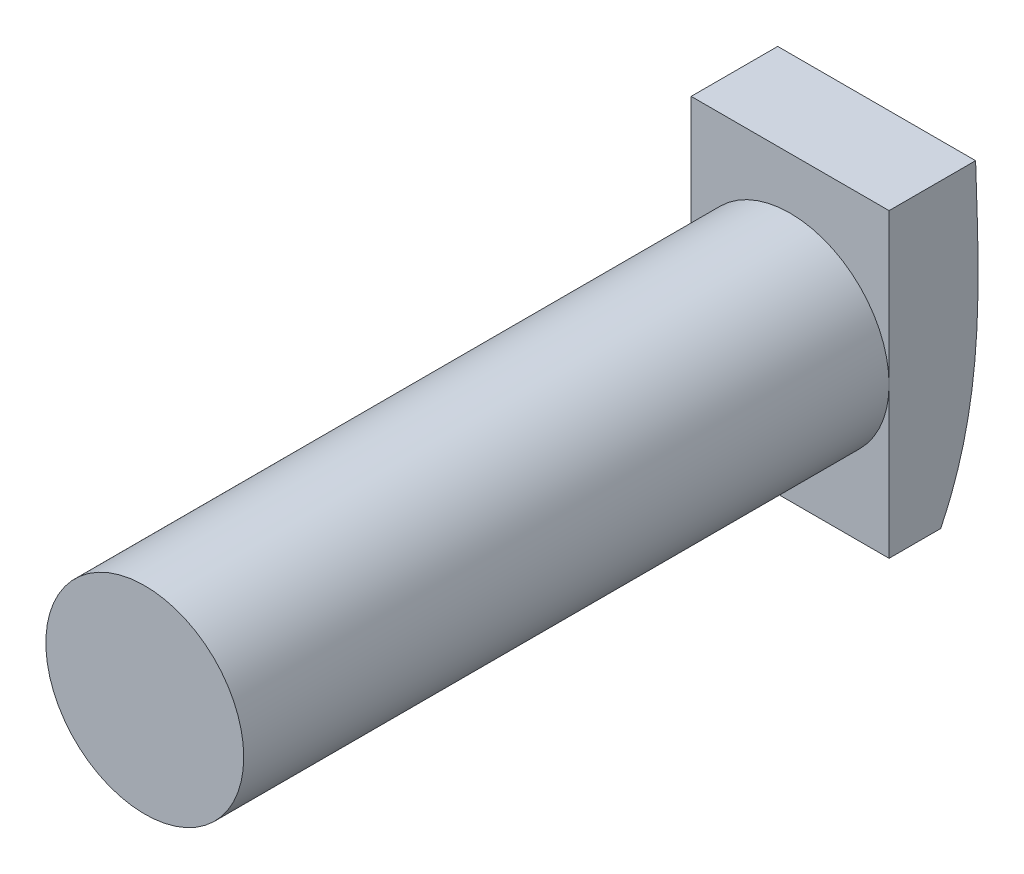
ISO-10303-21;
HEADER;
FILE_DESCRIPTION(('STEP AP214'),'2;1');
FILE_NAME('part.step','',(''),(''),'','','');
FILE_SCHEMA(('AUTOMOTIVE_DESIGN { 1 0 10303 214 1 1 1 1 }'));
ENDSEC;
DATA;
#1=APPLICATION_CONTEXT('core data for automotive mechanical design processes');
#2=APPLICATION_PROTOCOL_DEFINITION('international standard','automotive_design',2000,#1);
#3=PRODUCT_CONTEXT('',#1,'mechanical');
#4=PRODUCT('Part','Part','',(#3));
#5=PRODUCT_RELATED_PRODUCT_CATEGORY('part','',(#4));
#6=PRODUCT_DEFINITION_FORMATION('','',#4);
#7=PRODUCT_DEFINITION_CONTEXT('part definition',#1,'design');
#8=PRODUCT_DEFINITION('design','',#6,#7);
#9=PRODUCT_DEFINITION_SHAPE('','',#8);
#10=(LENGTH_UNIT() NAMED_UNIT(*) SI_UNIT(.MILLI.,.METRE.));
#11=(NAMED_UNIT(*) PLANE_ANGLE_UNIT() SI_UNIT($,.RADIAN.));
#12=(NAMED_UNIT(*) SI_UNIT($,.STERADIAN.) SOLID_ANGLE_UNIT());
#13=UNCERTAINTY_MEASURE_WITH_UNIT(LENGTH_MEASURE(1.E-05),#10,'distance_accuracy_value','');
#14=(GEOMETRIC_REPRESENTATION_CONTEXT(3) GLOBAL_UNCERTAINTY_ASSIGNED_CONTEXT((#13)) GLOBAL_UNIT_ASSIGNED_CONTEXT((#10,
#11,#12)) REPRESENTATION_CONTEXT('',''));
#15=CARTESIAN_POINT('',(0.,0.,0.));
#16=DIRECTION('',(0.,0.,1.));
#17=DIRECTION('',(1.,0.,0.));
#18=AXIS2_PLACEMENT_3D('',#15,#16,#17);
#19=CARTESIAN_POINT('',(0.,0.,15.));
#20=DIRECTION('',(0.,0.,-1.));
#21=DIRECTION('',(-1.,0.,0.));
#22=AXIS2_PLACEMENT_3D('',#19,#20,#21);
#23=CYLINDRICAL_SURFACE('',#22,2.3);
#24=CARTESIAN_POINT('',(0.,0.,15.));
#25=DIRECTION('',(0.,0.,1.));
#26=DIRECTION('',(1.,0.,0.));
#27=AXIS2_PLACEMENT_3D('',#24,#25,#26);
#28=CIRCLE('',#27,2.3);
#29=CARTESIAN_POINT('',(2.3,0.,15.));
#30=VERTEX_POINT('',#29);
#31=EDGE_CURVE('E11',#30,#30,#28,.T.);
#32=ORIENTED_EDGE('',*,*,#31,.F.);
#33=EDGE_LOOP('',(#32));
#34=FACE_BOUND('',#33,.T.);
#35=CARTESIAN_POINT('',(0.,0.,0.));
#36=DIRECTION('',(0.,0.,1.));
#37=DIRECTION('',(1.,0.,0.));
#38=AXIS2_PLACEMENT_3D('',#35,#36,#37);
#39=CIRCLE('',#38,2.3);
#40=CARTESIAN_POINT('',(2.3,0.,0.));
#41=VERTEX_POINT('',#40);
#42=CARTESIAN_POINT('',(-2.3,0.,0.));
#43=VERTEX_POINT('',#42);
#44=EDGE_CURVE('E35',#41,#43,#39,.T.);
#45=ORIENTED_EDGE('',*,*,#44,.T.);
#46=EDGE_CURVE('E107',#43,#41,#39,.T.);
#47=ORIENTED_EDGE('',*,*,#46,.T.);
#48=EDGE_LOOP('',(#45,#47));
#49=FACE_BOUND('',#48,.T.);
#50=ADVANCED_FACE('F32',(#34,#49),#23,.T.);
#51=CARTESIAN_POINT('',(0.,0.,15.));
#52=DIRECTION('',(0.,0.,1.));
#53=DIRECTION('',(1.,0.,0.));
#54=AXIS2_PLACEMENT_3D('',#51,#52,#53);
#55=PLANE('',#54);
#56=ORIENTED_EDGE('',*,*,#31,.T.);
#57=EDGE_LOOP('',(#56));
#58=FACE_BOUND('',#57,.T.);
#59=ADVANCED_FACE('F136',(#58),#55,.T.);
#60=CARTESIAN_POINT('',(0.,0.,0.));
#61=DIRECTION('',(0.,0.,1.));
#62=DIRECTION('',(1.,0.,0.));
#63=AXIS2_PLACEMENT_3D('',#60,#61,#62);
#64=PLANE('',#63);
#65=ORIENTED_EDGE('',*,*,#44,.F.);
#66=DIRECTION('',(0.,-1.,0.));
#67=VECTOR('',#66,1.);
#68=CARTESIAN_POINT('',(2.3,-3.5,0.));
#69=LINE('',#68,#67);
#70=CARTESIAN_POINT('',(2.3,3.5,0.));
#71=VERTEX_POINT('',#70);
#72=EDGE_CURVE('E54',#71,#41,#69,.T.);
#73=ORIENTED_EDGE('',*,*,#72,.F.);
#74=DIRECTION('',(1.,0.,0.));
#75=VECTOR('',#74,1.);
#76=CARTESIAN_POINT('',(2.3,3.5,0.));
#77=LINE('',#76,#75);
#78=CARTESIAN_POINT('',(-2.3,3.5,0.));
#79=VERTEX_POINT('',#78);
#80=EDGE_CURVE('E119',#79,#71,#77,.T.);
#81=ORIENTED_EDGE('',*,*,#80,.F.);
#82=DIRECTION('',(0.,1.,0.));
#83=VECTOR('',#82,1.);
#84=CARTESIAN_POINT('',(-2.3,-3.5,0.));
#85=LINE('',#84,#83);
#86=EDGE_CURVE('E118',#43,#79,#85,.T.);
#87=ORIENTED_EDGE('',*,*,#86,.F.);
#88=EDGE_LOOP('',(#65,#73,#81,#87));
#89=FACE_BOUND('',#88,.T.);
#90=ADVANCED_FACE('F116',(#89),#64,.T.);
#91=ORIENTED_EDGE('',*,*,#46,.F.);
#92=CARTESIAN_POINT('',(-2.3,-3.5,0.));
#93=VERTEX_POINT('',#92);
#94=EDGE_CURVE('E120',#93,#43,#85,.T.);
#95=ORIENTED_EDGE('',*,*,#94,.F.);
#96=DIRECTION('',(-1.,0.,0.));
#97=VECTOR('',#96,1.);
#98=CARTESIAN_POINT('',(2.3,-3.5,0.));
#99=LINE('',#98,#97);
#100=CARTESIAN_POINT('',(2.3,-3.5,0.));
#101=VERTEX_POINT('',#100);
#102=EDGE_CURVE('E97',#101,#93,#99,.T.);
#103=ORIENTED_EDGE('',*,*,#102,.F.);
#104=EDGE_CURVE('E123',#41,#101,#69,.T.);
#105=ORIENTED_EDGE('',*,*,#104,.F.);
#106=EDGE_LOOP('',(#91,#95,#103,#105));
#107=FACE_BOUND('',#106,.T.);
#108=ADVANCED_FACE('F127',(#107),#64,.T.);
#109=CARTESIAN_POINT('',(-2.3,-3.5,-3.));
#110=DIRECTION('',(1.,0.,0.));
#111=DIRECTION('',(0.,0.,-1.));
#112=AXIS2_PLACEMENT_3D('',#109,#110,#111);
#113=PLANE('',#112);
#114=DIRECTION('',(0.,0.,1.));
#115=VECTOR('',#114,1.);
#116=CARTESIAN_POINT('',(-2.3,3.5,-3.));
#117=LINE('',#116,#115);
#118=CARTESIAN_POINT('',(-2.3,3.5,-2.0115343006637));
#119=VERTEX_POINT('',#118);
#120=EDGE_CURVE('E93',#119,#79,#117,.T.);
#121=ORIENTED_EDGE('',*,*,#120,.F.);
#122=CARTESIAN_POINT('',(-2.3,3.5,-2.0115343006637));
#123=CARTESIAN_POINT('',(-2.3,1.18238891321301,-2.08240033991388));
#124=CARTESIAN_POINT('',(-2.3,-1.3344008735301,-2.26751473553337));
#125=CARTESIAN_POINT('',(-2.3,-3.5,-1.2));
#126=B_SPLINE_CURVE_WITH_KNOTS('',3,(#122,#123,#124,#125),.UNSPECIFIED.,.F.,.F.,(4,4),(0.,1.),.UNSPECIFIED.);
#127=CARTESIAN_POINT('',(-2.3,-3.5,-1.2));
#128=VERTEX_POINT('',#127);
#129=EDGE_CURVE('E79',#119,#128,#126,.T.);
#130=ORIENTED_EDGE('',*,*,#129,.T.);
#131=DIRECTION('',(0.,0.,1.));
#132=VECTOR('',#131,1.);
#133=CARTESIAN_POINT('',(-2.3,-3.5,-3.));
#134=LINE('',#133,#132);
#135=EDGE_CURVE('E90',#128,#93,#134,.T.);
#136=ORIENTED_EDGE('',*,*,#135,.T.);
#137=ORIENTED_EDGE('',*,*,#94,.T.);
#138=ORIENTED_EDGE('',*,*,#86,.T.);
#139=EDGE_LOOP('',(#121,#130,#136,#137,#138));
#140=FACE_BOUND('',#139,.T.);
#141=ADVANCED_FACE('F88',(#140),#113,.F.);
#142=CARTESIAN_POINT('',(2.3,3.5,-3.));
#143=DIRECTION('',(0.,-1.,0.));
#144=DIRECTION('',(0.,0.,-1.));
#145=AXIS2_PLACEMENT_3D('',#142,#143,#144);
#146=PLANE('',#145);
#147=DIRECTION('',(0.,0.,1.));
#148=VECTOR('',#147,1.);
#149=CARTESIAN_POINT('',(2.3,3.5,-3.));
#150=LINE('',#149,#148);
#151=CARTESIAN_POINT('',(2.3,3.5,-2.0115343006637));
#152=VERTEX_POINT('',#151);
#153=EDGE_CURVE('E101',#152,#71,#150,.T.);
#154=ORIENTED_EDGE('',*,*,#153,.F.);
#155=DIRECTION('',(1.,0.,0.));
#156=VECTOR('',#155,1.);
#157=CARTESIAN_POINT('',(-2.3,3.5,-2.0115343006637));
#158=LINE('',#157,#156);
#159=EDGE_CURVE('E84',#119,#152,#158,.T.);
#160=ORIENTED_EDGE('',*,*,#159,.F.);
#161=ORIENTED_EDGE('',*,*,#120,.T.);
#162=ORIENTED_EDGE('',*,*,#80,.T.);
#163=EDGE_LOOP('',(#154,#160,#161,#162));
#164=FACE_BOUND('',#163,.T.);
#165=ADVANCED_FACE('F134',(#164),#146,.F.);
#166=CARTESIAN_POINT('',(2.3,-3.5,-3.));
#167=DIRECTION('',(-1.,0.,0.));
#168=DIRECTION('',(0.,0.,1.));
#169=AXIS2_PLACEMENT_3D('',#166,#167,#168);
#170=PLANE('',#169);
#171=DIRECTION('',(0.,0.,1.));
#172=VECTOR('',#171,1.);
#173=CARTESIAN_POINT('',(2.3,-3.5,-3.));
#174=LINE('',#173,#172);
#175=CARTESIAN_POINT('',(2.3,-3.5,-1.2));
#176=VERTEX_POINT('',#175);
#177=EDGE_CURVE('E99',#176,#101,#174,.T.);
#178=ORIENTED_EDGE('',*,*,#177,.F.);
#179=CARTESIAN_POINT('',(2.3,3.5,-2.0115343006637));
#180=CARTESIAN_POINT('',(2.3,1.18238891321301,-2.08240033991388));
#181=CARTESIAN_POINT('',(2.3,-1.3344008735301,-2.26751473553337));
#182=CARTESIAN_POINT('',(2.3,-3.5,-1.2));
#183=B_SPLINE_CURVE_WITH_KNOTS('',3,(#179,#180,#181,#182),.UNSPECIFIED.,.F.,.F.,(4,4),(0.,1.),.UNSPECIFIED.);
#184=EDGE_CURVE('E46',#152,#176,#183,.T.);
#185=ORIENTED_EDGE('',*,*,#184,.F.);
#186=ORIENTED_EDGE('',*,*,#153,.T.);
#187=ORIENTED_EDGE('',*,*,#72,.T.);
#188=ORIENTED_EDGE('',*,*,#104,.T.);
#189=EDGE_LOOP('',(#178,#185,#186,#187,#188));
#190=FACE_BOUND('',#189,.T.);
#191=ADVANCED_FACE('F126',(#190),#170,.F.);
#192=CARTESIAN_POINT('',(2.3,-3.5,-3.));
#193=DIRECTION('',(0.,1.,0.));
#194=DIRECTION('',(0.,0.,1.));
#195=AXIS2_PLACEMENT_3D('',#192,#193,#194);
#196=PLANE('',#195);
#197=ORIENTED_EDGE('',*,*,#135,.F.);
#198=DIRECTION('',(1.,0.,0.));
#199=VECTOR('',#198,1.);
#200=CARTESIAN_POINT('',(-2.3,-3.5,-1.2));
#201=LINE('',#200,#199);
#202=EDGE_CURVE('E76',#128,#176,#201,.T.);
#203=ORIENTED_EDGE('',*,*,#202,.T.);
#204=ORIENTED_EDGE('',*,*,#177,.T.);
#205=ORIENTED_EDGE('',*,*,#102,.T.);
#206=EDGE_LOOP('',(#197,#203,#204,#205));
#207=FACE_BOUND('',#206,.T.);
#208=ADVANCED_FACE('F95',(#207),#196,.F.);
#209=DIRECTION('',(1.,0.,0.));
#210=VECTOR('',#209,1.);
#211=SURFACE_OF_LINEAR_EXTRUSION('',#126,#210);
#212=ORIENTED_EDGE('',*,*,#184,.T.);
#213=ORIENTED_EDGE('',*,*,#202,.F.);
#214=ORIENTED_EDGE('',*,*,#129,.F.);
#215=ORIENTED_EDGE('',*,*,#159,.T.);
#216=EDGE_LOOP('',(#212,#213,#214,#215));
#217=FACE_BOUND('',#216,.T.);
#218=ADVANCED_FACE('F78',(#217),#211,.F.);
#219=CLOSED_SHELL('',(#50,#59,#90,#108,#141,#165,#191,#208,#218));
#220=MANIFOLD_SOLID_BREP('B2',#219);
#221=ADVANCED_BREP_SHAPE_REPRESENTATION('',(#18,#220),#14);
#222=SHAPE_DEFINITION_REPRESENTATION(#9,#221);
ENDSEC;
END-ISO-10303-21;
